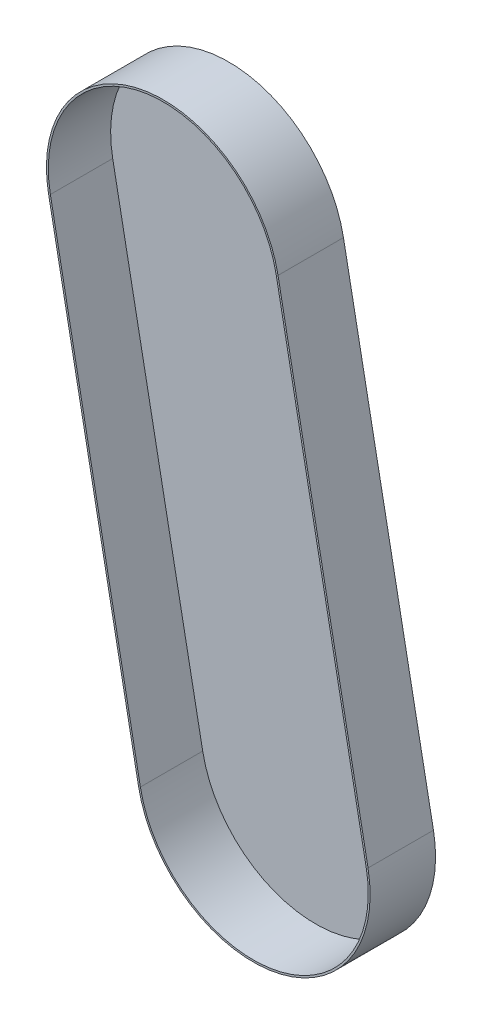
ISO-10303-21;
HEADER;
FILE_DESCRIPTION(('STEP AP214'),'2;1');
FILE_NAME('part.step','',(''),(''),'','','');
FILE_SCHEMA(('AUTOMOTIVE_DESIGN { 1 0 10303 214 1 1 1 1 }'));
ENDSEC;
DATA;
#1=APPLICATION_CONTEXT('core data for automotive mechanical design processes');
#2=APPLICATION_PROTOCOL_DEFINITION('international standard','automotive_design',2000,#1);
#3=PRODUCT_CONTEXT('',#1,'mechanical');
#4=PRODUCT('Part','Part','',(#3));
#5=PRODUCT_RELATED_PRODUCT_CATEGORY('part','',(#4));
#6=PRODUCT_DEFINITION_FORMATION('','',#4);
#7=PRODUCT_DEFINITION_CONTEXT('part definition',#1,'design');
#8=PRODUCT_DEFINITION('design','',#6,#7);
#9=PRODUCT_DEFINITION_SHAPE('','',#8);
#10=(LENGTH_UNIT() NAMED_UNIT(*) SI_UNIT(.MILLI.,.METRE.));
#11=(NAMED_UNIT(*) PLANE_ANGLE_UNIT() SI_UNIT($,.RADIAN.));
#12=(NAMED_UNIT(*) SI_UNIT($,.STERADIAN.) SOLID_ANGLE_UNIT());
#13=UNCERTAINTY_MEASURE_WITH_UNIT(LENGTH_MEASURE(1.E-05),#10,'distance_accuracy_value','');
#14=(GEOMETRIC_REPRESENTATION_CONTEXT(3) GLOBAL_UNCERTAINTY_ASSIGNED_CONTEXT((#13)) GLOBAL_UNIT_ASSIGNED_CONTEXT((#10,
#11,#12)) REPRESENTATION_CONTEXT('',''));
#15=CARTESIAN_POINT('',(0.,0.,0.));
#16=DIRECTION('',(0.,0.,1.));
#17=DIRECTION('',(1.,0.,0.));
#18=AXIS2_PLACEMENT_3D('',#15,#16,#17);
#19=CARTESIAN_POINT('',(-98.4489912165401,219.506602840018,2.));
#20=DIRECTION('',(0.,0.,-1.));
#21=DIRECTION('',(-1.,0.,0.));
#22=AXIS2_PLACEMENT_3D('',#19,#20,#21);
#23=CYLINDRICAL_SURFACE('',#22,75.);
#24=CARTESIAN_POINT('',(-98.4489912165401,219.506602840018,0.));
#25=DIRECTION('',(0.,0.,1.));
#26=DIRECTION('',(1.,0.,0.));
#27=AXIS2_PLACEMENT_3D('',#24,#25,#26);
#28=CIRCLE('',#27,75.);
#29=CARTESIAN_POINT('',(-24.7971819482108,233.663261750285,0.));
#30=VERTEX_POINT('',#29);
#31=CARTESIAN_POINT('',(-172.100800484869,205.349943929752,0.));
#32=VERTEX_POINT('',#31);
#33=EDGE_CURVE('E144',#30,#32,#28,.T.);
#34=ORIENTED_EDGE('',*,*,#33,.T.);
#35=DIRECTION('',(0.,0.,-1.));
#36=VECTOR('',#35,1.);
#37=CARTESIAN_POINT('',(-172.100800484869,205.349943929752,2.));
#38=LINE('',#37,#36);
#39=CARTESIAN_POINT('',(-172.100800484869,205.349943929752,42.));
#40=VERTEX_POINT('',#39);
#41=EDGE_CURVE('E11',#40,#32,#38,.T.);
#42=ORIENTED_EDGE('',*,*,#41,.F.);
#43=CARTESIAN_POINT('',(-98.4489912165401,219.506602840018,42.));
#44=DIRECTION('',(0.,0.,1.));
#45=DIRECTION('',(1.,0.,0.));
#46=AXIS2_PLACEMENT_3D('',#43,#44,#45);
#47=CIRCLE('',#46,75.);
#48=CARTESIAN_POINT('',(-24.7971819482108,233.663261750285,42.));
#49=VERTEX_POINT('',#48);
#50=EDGE_CURVE('E111',#49,#40,#47,.T.);
#51=ORIENTED_EDGE('',*,*,#50,.F.);
#52=DIRECTION('',(0.,0.,-1.));
#53=VECTOR('',#52,1.);
#54=CARTESIAN_POINT('',(-24.7971819482108,233.663261750285,2.));
#55=LINE('',#54,#53);
#56=EDGE_CURVE('E153',#49,#30,#55,.T.);
#57=ORIENTED_EDGE('',*,*,#56,.T.);
#58=EDGE_LOOP('',(#34,#42,#51,#57));
#59=FACE_BOUND('',#58,.T.);
#60=ADVANCED_FACE('F33',(#59),#23,.T.);
#61=CARTESIAN_POINT('',(-172.100800484869,205.349943929752,2.));
#62=DIRECTION('',(0.982024123577725,0.188755452136891,0.));
#63=DIRECTION('',(-0.188755452136891,0.982024123577725,0.));
#64=AXIS2_PLACEMENT_3D('',#61,#62,#63);
#65=PLANE('',#64);
#66=DIRECTION('',(0.188755452136891,-0.982024123577724,0.));
#67=VECTOR('',#66,1.);
#68=CARTESIAN_POINT('',(-172.100800484869,205.349943929752,0.));
#69=LINE('',#68,#67);
#70=CARTESIAN_POINT('',(-114.337802185355,-95.169363661765,0.));
#71=VERTEX_POINT('',#70);
#72=EDGE_CURVE('E147',#32,#71,#69,.T.);
#73=ORIENTED_EDGE('',*,*,#72,.T.);
#74=DIRECTION('',(0.,0.,-1.));
#75=VECTOR('',#74,1.);
#76=CARTESIAN_POINT('',(-114.337802185355,-95.169363661765,2.));
#77=LINE('',#76,#75);
#78=CARTESIAN_POINT('',(-114.337802185355,-95.169363661765,42.));
#79=VERTEX_POINT('',#78);
#80=EDGE_CURVE('E40',#79,#71,#77,.T.);
#81=ORIENTED_EDGE('',*,*,#80,.F.);
#82=DIRECTION('',(0.188755452136891,-0.982024123577724,0.));
#83=VECTOR('',#82,1.);
#84=CARTESIAN_POINT('',(-172.100800484869,205.349943929752,42.));
#85=LINE('',#84,#83);
#86=EDGE_CURVE('E135',#40,#79,#85,.T.);
#87=ORIENTED_EDGE('',*,*,#86,.F.);
#88=ORIENTED_EDGE('',*,*,#41,.T.);
#89=EDGE_LOOP('',(#73,#81,#87,#88));
#90=FACE_BOUND('',#89,.T.);
#91=ADVANCED_FACE('F175',(#90),#65,.F.);
#92=CARTESIAN_POINT('',(-40.6859929170259,-81.0127047514982,2.));
#93=DIRECTION('',(0.,0.,-1.));
#94=DIRECTION('',(-1.,0.,0.));
#95=AXIS2_PLACEMENT_3D('',#92,#93,#94);
#96=CYLINDRICAL_SURFACE('',#95,75.);
#97=CARTESIAN_POINT('',(-40.6859929170259,-81.0127047514982,0.));
#98=DIRECTION('',(0.,0.,1.));
#99=DIRECTION('',(1.,0.,0.));
#100=AXIS2_PLACEMENT_3D('',#97,#98,#99);
#101=CIRCLE('',#100,75.);
#102=CARTESIAN_POINT('',(32.9658163513034,-66.8560458412314,0.));
#103=VERTEX_POINT('',#102);
#104=EDGE_CURVE('E149',#71,#103,#101,.T.);
#105=ORIENTED_EDGE('',*,*,#104,.T.);
#106=DIRECTION('',(0.,0.,-1.));
#107=VECTOR('',#106,1.);
#108=CARTESIAN_POINT('',(32.9658163513034,-66.8560458412314,2.));
#109=LINE('',#108,#107);
#110=CARTESIAN_POINT('',(32.9658163513034,-66.8560458412314,42.));
#111=VERTEX_POINT('',#110);
#112=EDGE_CURVE('E156',#111,#103,#109,.T.);
#113=ORIENTED_EDGE('',*,*,#112,.F.);
#114=CARTESIAN_POINT('',(-40.6859929170259,-81.0127047514982,42.));
#115=DIRECTION('',(0.,0.,1.));
#116=DIRECTION('',(1.,0.,0.));
#117=AXIS2_PLACEMENT_3D('',#114,#115,#116);
#118=CIRCLE('',#117,75.);
#119=EDGE_CURVE('E138',#79,#111,#118,.T.);
#120=ORIENTED_EDGE('',*,*,#119,.F.);
#121=ORIENTED_EDGE('',*,*,#80,.T.);
#122=EDGE_LOOP('',(#105,#113,#120,#121));
#123=FACE_BOUND('',#122,.T.);
#124=ADVANCED_FACE('F162',(#123),#96,.T.);
#125=CARTESIAN_POINT('',(-24.7971819482108,233.663261750285,2.));
#126=DIRECTION('',(-0.982024123577725,-0.188755452136891,0.));
#127=DIRECTION('',(0.188755452136891,-0.982024123577725,0.));
#128=AXIS2_PLACEMENT_3D('',#125,#126,#127);
#129=PLANE('',#128);
#130=DIRECTION('',(-0.18875545213689,0.982024123577724,0.));
#131=VECTOR('',#130,1.);
#132=CARTESIAN_POINT('',(-24.7971819482108,233.663261750285,0.));
#133=LINE('',#132,#131);
#134=EDGE_CURVE('E151',#103,#30,#133,.T.);
#135=ORIENTED_EDGE('',*,*,#134,.T.);
#136=ORIENTED_EDGE('',*,*,#56,.F.);
#137=DIRECTION('',(-0.18875545213689,0.982024123577724,0.));
#138=VECTOR('',#137,1.);
#139=CARTESIAN_POINT('',(-24.7971819482108,233.663261750285,42.));
#140=LINE('',#139,#138);
#141=EDGE_CURVE('E141',#111,#49,#140,.T.);
#142=ORIENTED_EDGE('',*,*,#141,.F.);
#143=ORIENTED_EDGE('',*,*,#112,.T.);
#144=EDGE_LOOP('',(#135,#136,#142,#143));
#145=FACE_BOUND('',#144,.T.);
#146=ADVANCED_FACE('F170',(#145),#129,.F.);
#147=CARTESIAN_POINT('',(-98.4489912165401,219.506602840018,0.));
#148=DIRECTION('',(0.,0.,1.));
#149=DIRECTION('',(1.,0.,0.));
#150=AXIS2_PLACEMENT_3D('',#147,#148,#149);
#151=PLANE('',#150);
#152=ORIENTED_EDGE('',*,*,#33,.F.);
#153=ORIENTED_EDGE('',*,*,#134,.F.);
#154=ORIENTED_EDGE('',*,*,#104,.F.);
#155=ORIENTED_EDGE('',*,*,#72,.F.);
#156=EDGE_LOOP('',(#152,#153,#154,#155));
#157=FACE_BOUND('',#156,.T.);
#158=ADVANCED_FACE('F168',(#157),#151,.F.);
#159=CARTESIAN_POINT('',(-98.4489912165401,219.506602840018,42.));
#160=DIRECTION('',(0.,0.,1.));
#161=DIRECTION('',(1.,0.,0.));
#162=AXIS2_PLACEMENT_3D('',#159,#160,#161);
#163=PLANE('',#162);
#164=ORIENTED_EDGE('',*,*,#50,.T.);
#165=ORIENTED_EDGE('',*,*,#86,.T.);
#166=ORIENTED_EDGE('',*,*,#119,.T.);
#167=ORIENTED_EDGE('',*,*,#141,.T.);
#168=EDGE_LOOP('',(#164,#165,#166,#167));
#169=FACE_BOUND('',#168,.T.);
#170=DIRECTION('',(0.188755452136891,-0.982024123577725,0.));
#171=VECTOR('',#170,1.);
#172=CARTESIAN_POINT('',(-170.922371536576,205.576450472316,42.));
#173=LINE('',#172,#171);
#174=CARTESIAN_POINT('',(-170.922371536576,205.576450472316,42.));
#175=VERTEX_POINT('',#174);
#176=CARTESIAN_POINT('',(-113.159373237062,-94.9428571192007,42.));
#177=VERTEX_POINT('',#176);
#178=EDGE_CURVE('E105',#175,#177,#173,.T.);
#179=ORIENTED_EDGE('',*,*,#178,.F.);
#180=CARTESIAN_POINT('',(-98.4489912165401,219.506602840018,42.));
#181=DIRECTION('',(0.,0.,1.));
#182=DIRECTION('',(1.,0.,0.));
#183=AXIS2_PLACEMENT_3D('',#180,#181,#182);
#184=CIRCLE('',#183,73.8);
#185=CARTESIAN_POINT('',(-25.975610896504,233.436755207721,42.));
#186=VERTEX_POINT('',#185);
#187=EDGE_CURVE('E96',#186,#175,#184,.T.);
#188=ORIENTED_EDGE('',*,*,#187,.F.);
#189=DIRECTION('',(-0.18875545213689,0.982024123577725,0.));
#190=VECTOR('',#189,1.);
#191=CARTESIAN_POINT('',(-25.975610896504,233.436755207721,42.));
#192=LINE('',#191,#190);
#193=CARTESIAN_POINT('',(31.7873874030101,-67.0825523837957,42.));
#194=VERTEX_POINT('',#193);
#195=EDGE_CURVE('E119',#194,#186,#192,.T.);
#196=ORIENTED_EDGE('',*,*,#195,.F.);
#197=CARTESIAN_POINT('',(-40.6859929170259,-81.0127047514982,42.));
#198=DIRECTION('',(0.,0.,1.));
#199=DIRECTION('',(1.,0.,0.));
#200=AXIS2_PLACEMENT_3D('',#197,#198,#199);
#201=CIRCLE('',#200,73.8);
#202=EDGE_CURVE('E117',#177,#194,#201,.T.);
#203=ORIENTED_EDGE('',*,*,#202,.F.);
#204=EDGE_LOOP('',(#179,#188,#196,#203));
#205=FACE_BOUND('',#204,.T.);
#206=ADVANCED_FACE('F115',(#169,#205),#163,.T.);
#207=CARTESIAN_POINT('',(-98.4489912165401,219.506602840018,42.));
#208=DIRECTION('',(0.,0.,-1.));
#209=DIRECTION('',(-1.,0.,0.));
#210=AXIS2_PLACEMENT_3D('',#207,#208,#209);
#211=CYLINDRICAL_SURFACE('',#210,73.8);
#212=CARTESIAN_POINT('',(-98.4489912165401,219.506602840018,2.));
#213=DIRECTION('',(0.,0.,1.));
#214=DIRECTION('',(1.,0.,0.));
#215=AXIS2_PLACEMENT_3D('',#212,#213,#214);
#216=CIRCLE('',#215,73.8);
#217=CARTESIAN_POINT('',(-25.9756108965041,233.436755207721,2.));
#218=VERTEX_POINT('',#217);
#219=CARTESIAN_POINT('',(-170.922371536576,205.576450472316,2.));
#220=VERTEX_POINT('',#219);
#221=EDGE_CURVE('E47',#218,#220,#216,.T.);
#222=ORIENTED_EDGE('',*,*,#221,.F.);
#223=DIRECTION('',(0.,0.,-1.));
#224=VECTOR('',#223,1.);
#225=CARTESIAN_POINT('',(-25.975610896504,233.436755207721,42.));
#226=LINE('',#225,#224);
#227=EDGE_CURVE('E101',#186,#218,#226,.T.);
#228=ORIENTED_EDGE('',*,*,#227,.F.);
#229=ORIENTED_EDGE('',*,*,#187,.T.);
#230=DIRECTION('',(0.,0.,-1.));
#231=VECTOR('',#230,1.);
#232=CARTESIAN_POINT('',(-170.922371536576,205.576450472316,42.));
#233=LINE('',#232,#231);
#234=EDGE_CURVE('E99',#175,#220,#233,.T.);
#235=ORIENTED_EDGE('',*,*,#234,.T.);
#236=EDGE_LOOP('',(#222,#228,#229,#235));
#237=FACE_BOUND('',#236,.T.);
#238=ADVANCED_FACE('F98',(#237),#211,.F.);
#239=CARTESIAN_POINT('',(-170.922371536576,205.576450472316,42.));
#240=DIRECTION('',(0.982024123577725,0.188755452136891,0.));
#241=DIRECTION('',(-0.188755452136891,0.982024123577725,0.));
#242=AXIS2_PLACEMENT_3D('',#239,#240,#241);
#243=PLANE('',#242);
#244=DIRECTION('',(0.188755452136891,-0.982024123577725,0.));
#245=VECTOR('',#244,1.);
#246=CARTESIAN_POINT('',(-170.922371536576,205.576450472316,2.));
#247=LINE('',#246,#245);
#248=CARTESIAN_POINT('',(-113.159373237062,-94.9428571192007,2.));
#249=VERTEX_POINT('',#248);
#250=EDGE_CURVE('E51',#220,#249,#247,.T.);
#251=ORIENTED_EDGE('',*,*,#250,.F.);
#252=ORIENTED_EDGE('',*,*,#234,.F.);
#253=ORIENTED_EDGE('',*,*,#178,.T.);
#254=DIRECTION('',(0.,0.,-1.));
#255=VECTOR('',#254,1.);
#256=CARTESIAN_POINT('',(-113.159373237062,-94.9428571192007,42.));
#257=LINE('',#256,#255);
#258=EDGE_CURVE('E112',#177,#249,#257,.T.);
#259=ORIENTED_EDGE('',*,*,#258,.T.);
#260=EDGE_LOOP('',(#251,#252,#253,#259));
#261=FACE_BOUND('',#260,.T.);
#262=ADVANCED_FACE('F109',(#261),#243,.T.);
#263=CARTESIAN_POINT('',(-40.6859929170259,-81.0127047514982,42.));
#264=DIRECTION('',(0.,0.,-1.));
#265=DIRECTION('',(-1.,0.,0.));
#266=AXIS2_PLACEMENT_3D('',#263,#264,#265);
#267=CYLINDRICAL_SURFACE('',#266,73.8);
#268=CARTESIAN_POINT('',(-40.6859929170259,-81.0127047514982,2.));
#269=DIRECTION('',(0.,0.,1.));
#270=DIRECTION('',(1.,0.,0.));
#271=AXIS2_PLACEMENT_3D('',#268,#269,#270);
#272=CIRCLE('',#271,73.8);
#273=CARTESIAN_POINT('',(31.7873874030101,-67.0825523837957,2.));
#274=VERTEX_POINT('',#273);
#275=EDGE_CURVE('E125',#249,#274,#272,.T.);
#276=ORIENTED_EDGE('',*,*,#275,.F.);
#277=ORIENTED_EDGE('',*,*,#258,.F.);
#278=ORIENTED_EDGE('',*,*,#202,.T.);
#279=DIRECTION('',(0.,0.,-1.));
#280=VECTOR('',#279,1.);
#281=CARTESIAN_POINT('',(31.7873874030101,-67.0825523837957,42.));
#282=LINE('',#281,#280);
#283=EDGE_CURVE('E129',#194,#274,#282,.T.);
#284=ORIENTED_EDGE('',*,*,#283,.T.);
#285=EDGE_LOOP('',(#276,#277,#278,#284));
#286=FACE_BOUND('',#285,.T.);
#287=ADVANCED_FACE('F197',(#286),#267,.F.);
#288=CARTESIAN_POINT('',(-25.975610896504,233.436755207721,42.));
#289=DIRECTION('',(-0.982024123577725,-0.18875545213689,0.));
#290=DIRECTION('',(0.188755452136891,-0.982024123577725,0.));
#291=AXIS2_PLACEMENT_3D('',#288,#289,#290);
#292=PLANE('',#291);
#293=DIRECTION('',(-0.18875545213689,0.982024123577725,0.));
#294=VECTOR('',#293,1.);
#295=CARTESIAN_POINT('',(-25.975610896504,233.436755207721,2.));
#296=LINE('',#295,#294);
#297=EDGE_CURVE('E106',#274,#218,#296,.T.);
#298=ORIENTED_EDGE('',*,*,#297,.F.);
#299=ORIENTED_EDGE('',*,*,#283,.F.);
#300=ORIENTED_EDGE('',*,*,#195,.T.);
#301=ORIENTED_EDGE('',*,*,#227,.T.);
#302=EDGE_LOOP('',(#298,#299,#300,#301));
#303=FACE_BOUND('',#302,.T.);
#304=ADVANCED_FACE('F190',(#303),#292,.T.);
#305=CARTESIAN_POINT('',(-98.4489912165401,219.506602840018,2.));
#306=DIRECTION('',(0.,0.,1.));
#307=DIRECTION('',(1.,0.,0.));
#308=AXIS2_PLACEMENT_3D('',#305,#306,#307);
#309=PLANE('',#308);
#310=ORIENTED_EDGE('',*,*,#221,.T.);
#311=ORIENTED_EDGE('',*,*,#250,.T.);
#312=ORIENTED_EDGE('',*,*,#275,.T.);
#313=ORIENTED_EDGE('',*,*,#297,.T.);
#314=EDGE_LOOP('',(#310,#311,#312,#313));
#315=FACE_BOUND('',#314,.T.);
#316=ADVANCED_FACE('F187',(#315),#309,.T.);
#317=CLOSED_SHELL('',(#60,#91,#124,#146,#158,#206,#238,#262,#287,#304,#316));
#318=MANIFOLD_SOLID_BREP('B2',#317);
#319=ADVANCED_BREP_SHAPE_REPRESENTATION('',(#18,#318),#14);
#320=SHAPE_DEFINITION_REPRESENTATION(#9,#319);
ENDSEC;
END-ISO-10303-21;
